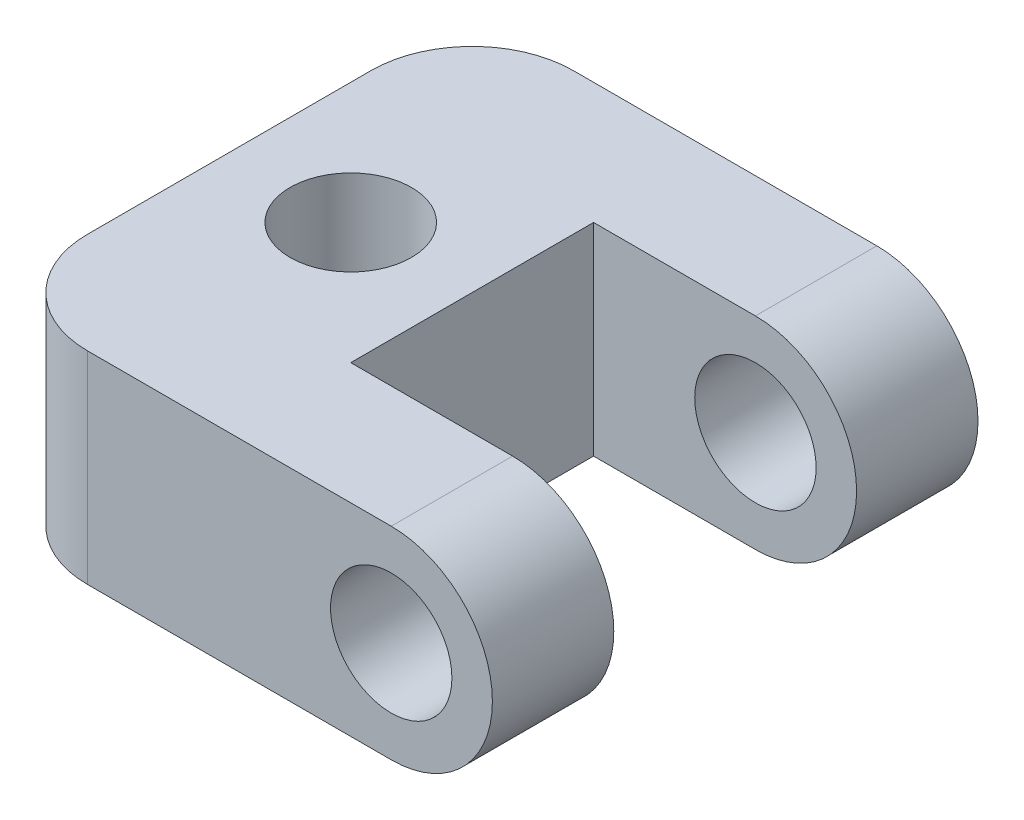
ISO-10303-21;
HEADER;
FILE_DESCRIPTION(('STEP AP214'),'2;1');
FILE_NAME('part.step','',(''),(''),'','','');
FILE_SCHEMA(('AUTOMOTIVE_DESIGN { 1 0 10303 214 1 1 1 1 }'));
ENDSEC;
DATA;
#1=APPLICATION_CONTEXT('core data for automotive mechanical design processes');
#2=APPLICATION_PROTOCOL_DEFINITION('international standard','automotive_design',2000,#1);
#3=PRODUCT_CONTEXT('',#1,'mechanical');
#4=PRODUCT('Part','Part','',(#3));
#5=PRODUCT_RELATED_PRODUCT_CATEGORY('part','',(#4));
#6=PRODUCT_DEFINITION_FORMATION('','',#4);
#7=PRODUCT_DEFINITION_CONTEXT('part definition',#1,'design');
#8=PRODUCT_DEFINITION('design','',#6,#7);
#9=PRODUCT_DEFINITION_SHAPE('','',#8);
#10=(LENGTH_UNIT() NAMED_UNIT(*) SI_UNIT(.MILLI.,.METRE.));
#11=(NAMED_UNIT(*) PLANE_ANGLE_UNIT() SI_UNIT($,.RADIAN.));
#12=(NAMED_UNIT(*) SI_UNIT($,.STERADIAN.) SOLID_ANGLE_UNIT());
#13=UNCERTAINTY_MEASURE_WITH_UNIT(LENGTH_MEASURE(1.E-05),#10,'distance_accuracy_value','');
#14=(GEOMETRIC_REPRESENTATION_CONTEXT(3) GLOBAL_UNCERTAINTY_ASSIGNED_CONTEXT((#13)) GLOBAL_UNIT_ASSIGNED_CONTEXT((#10,
#11,#12)) REPRESENTATION_CONTEXT('',''));
#15=CARTESIAN_POINT('',(0.,0.,0.));
#16=DIRECTION('',(0.,0.,1.));
#17=DIRECTION('',(1.,0.,0.));
#18=AXIS2_PLACEMENT_3D('',#15,#16,#17);
#19=CARTESIAN_POINT('',(10.,2.5,-12.));
#20=DIRECTION('',(0.,0.,1.));
#21=DIRECTION('',(1.,0.,0.));
#22=AXIS2_PLACEMENT_3D('',#19,#20,#21);
#23=CYLINDRICAL_SURFACE('',#22,2.5);
#24=CARTESIAN_POINT('',(10.,2.5,-9.));
#25=DIRECTION('',(0.,0.,-1.));
#26=DIRECTION('',(-1.,0.,0.));
#27=AXIS2_PLACEMENT_3D('',#24,#25,#26);
#28=CIRCLE('',#27,2.5);
#29=CARTESIAN_POINT('',(10.,0.,-9.));
#30=VERTEX_POINT('',#29);
#31=CARTESIAN_POINT('',(10.,5.,-9.));
#32=VERTEX_POINT('',#31);
#33=EDGE_CURVE('E154',#30,#32,#28,.F.);
#34=ORIENTED_EDGE('',*,*,#33,.F.);
#35=DIRECTION('',(0.,0.,1.));
#36=VECTOR('',#35,1.);
#37=CARTESIAN_POINT('',(10.,0.,-12.));
#38=LINE('',#37,#36);
#39=CARTESIAN_POINT('',(10.,0.,-12.));
#40=VERTEX_POINT('',#39);
#41=EDGE_CURVE('E177',#40,#30,#38,.T.);
#42=ORIENTED_EDGE('',*,*,#41,.F.);
#43=CARTESIAN_POINT('',(10.,2.5,-12.));
#44=DIRECTION('',(0.,0.,1.));
#45=DIRECTION('',(1.,0.,0.));
#46=AXIS2_PLACEMENT_3D('',#43,#44,#45);
#47=CIRCLE('',#46,2.5);
#48=CARTESIAN_POINT('',(10.,5.,-12.));
#49=VERTEX_POINT('',#48);
#50=EDGE_CURVE('E159',#40,#49,#47,.T.);
#51=ORIENTED_EDGE('',*,*,#50,.T.);
#52=DIRECTION('',(0.,0.,1.));
#53=VECTOR('',#52,1.);
#54=CARTESIAN_POINT('',(10.,5.,-12.));
#55=LINE('',#54,#53);
#56=EDGE_CURVE('E173',#49,#32,#55,.T.);
#57=ORIENTED_EDGE('',*,*,#56,.T.);
#58=EDGE_LOOP('',(#34,#42,#51,#57));
#59=FACE_BOUND('',#58,.T.);
#60=ADVANCED_FACE('F35',(#59),#23,.T.);
#61=CARTESIAN_POINT('',(0.,5.,-12.));
#62=DIRECTION('',(-1.,0.,0.));
#63=DIRECTION('',(0.,0.,1.));
#64=AXIS2_PLACEMENT_3D('',#61,#62,#63);
#65=PLANE('',#64);
#66=DIRECTION('',(0.,0.,1.));
#67=VECTOR('',#66,1.);
#68=CARTESIAN_POINT('',(0.,5.,-12.));
#69=LINE('',#68,#67);
#70=CARTESIAN_POINT('',(0.,5.,-9.5));
#71=VERTEX_POINT('',#70);
#72=CARTESIAN_POINT('',(0.,5.,-2.5));
#73=VERTEX_POINT('',#72);
#74=EDGE_CURVE('E171',#71,#73,#69,.T.);
#75=ORIENTED_EDGE('',*,*,#74,.F.);
#76=DIRECTION('',(0.,-1.,0.));
#77=VECTOR('',#76,1.);
#78=CARTESIAN_POINT('',(0.,0.,-9.5));
#79=LINE('',#78,#77);
#80=CARTESIAN_POINT('',(0.,0.,-9.5));
#81=VERTEX_POINT('',#80);
#82=EDGE_CURVE('E189',#71,#81,#79,.T.);
#83=ORIENTED_EDGE('',*,*,#82,.T.);
#84=DIRECTION('',(0.,0.,1.));
#85=VECTOR('',#84,1.);
#86=CARTESIAN_POINT('',(0.,0.,-12.));
#87=LINE('',#86,#85);
#88=CARTESIAN_POINT('',(0.,0.,-2.5));
#89=VERTEX_POINT('',#88);
#90=EDGE_CURVE('E165',#81,#89,#87,.T.);
#91=ORIENTED_EDGE('',*,*,#90,.T.);
#92=DIRECTION('',(0.,-1.,0.));
#93=VECTOR('',#92,1.);
#94=CARTESIAN_POINT('',(0.,5.,-2.5));
#95=LINE('',#94,#93);
#96=EDGE_CURVE('E183',#89,#73,#95,.F.);
#97=ORIENTED_EDGE('',*,*,#96,.T.);
#98=EDGE_LOOP('',(#75,#83,#91,#97));
#99=FACE_BOUND('',#98,.T.);
#100=ADVANCED_FACE('F203',(#99),#65,.T.);
#101=CARTESIAN_POINT('',(10.,5.,-12.));
#102=DIRECTION('',(0.,1.,0.));
#103=DIRECTION('',(0.,0.,1.));
#104=AXIS2_PLACEMENT_3D('',#101,#102,#103);
#105=PLANE('',#104);
#106=CARTESIAN_POINT('',(3.,5.,-6.));
#107=DIRECTION('',(0.,1.,0.));
#108=DIRECTION('',(0.,0.,1.));
#109=AXIS2_PLACEMENT_3D('',#106,#107,#108);
#110=CIRCLE('',#109,1.5);
#111=CARTESIAN_POINT('',(3.,5.,-4.5));
#112=VERTEX_POINT('',#111);
#113=EDGE_CURVE('E275',#112,#112,#110,.T.);
#114=ORIENTED_EDGE('',*,*,#113,.F.);
#115=EDGE_LOOP('',(#114));
#116=FACE_BOUND('',#115,.T.);
#117=DIRECTION('',(-1.,0.,0.));
#118=VECTOR('',#117,1.);
#119=CARTESIAN_POINT('',(10.,5.,-12.));
#120=LINE('',#119,#118);
#121=CARTESIAN_POINT('',(2.5,5.,-12.));
#122=VERTEX_POINT('',#121);
#123=EDGE_CURVE('E163',#49,#122,#120,.T.);
#124=ORIENTED_EDGE('',*,*,#123,.T.);
#125=CARTESIAN_POINT('',(2.5,5.,-9.5));
#126=DIRECTION('',(0.,1.,0.));
#127=DIRECTION('',(0.,0.,1.));
#128=AXIS2_PLACEMENT_3D('',#125,#126,#127);
#129=CIRCLE('',#128,2.5);
#130=EDGE_CURVE('E43',#122,#71,#129,.T.);
#131=ORIENTED_EDGE('',*,*,#130,.T.);
#132=ORIENTED_EDGE('',*,*,#74,.T.);
#133=CARTESIAN_POINT('',(2.5,5.,-2.5));
#134=DIRECTION('',(0.,1.,0.));
#135=DIRECTION('',(0.,0.,1.));
#136=AXIS2_PLACEMENT_3D('',#133,#134,#135);
#137=CIRCLE('',#136,2.5);
#138=CARTESIAN_POINT('',(2.5,5.,0.));
#139=VERTEX_POINT('',#138);
#140=EDGE_CURVE('E50',#73,#139,#137,.T.);
#141=ORIENTED_EDGE('',*,*,#140,.T.);
#142=DIRECTION('',(-1.,0.,0.));
#143=VECTOR('',#142,1.);
#144=CARTESIAN_POINT('',(10.,5.,0.));
#145=LINE('',#144,#143);
#146=CARTESIAN_POINT('',(10.,5.,0.));
#147=VERTEX_POINT('',#146);
#148=EDGE_CURVE('E160',#147,#139,#145,.T.);
#149=ORIENTED_EDGE('',*,*,#148,.F.);
#150=CARTESIAN_POINT('',(10.,5.,-3.));
#151=VERTEX_POINT('',#150);
#152=EDGE_CURVE('E176',#151,#147,#55,.T.);
#153=ORIENTED_EDGE('',*,*,#152,.F.);
#154=DIRECTION('',(1.,0.,0.));
#155=VECTOR('',#154,1.);
#156=CARTESIAN_POINT('',(6.,5.,-3.));
#157=LINE('',#156,#155);
#158=CARTESIAN_POINT('',(6.,5.,-3.));
#159=VERTEX_POINT('',#158);
#160=EDGE_CURVE('E144',#159,#151,#157,.T.);
#161=ORIENTED_EDGE('',*,*,#160,.F.);
#162=DIRECTION('',(0.,0.,1.));
#163=VECTOR('',#162,1.);
#164=CARTESIAN_POINT('',(6.,5.,-9.));
#165=LINE('',#164,#163);
#166=CARTESIAN_POINT('',(6.,5.,-9.));
#167=VERTEX_POINT('',#166);
#168=EDGE_CURVE('E124',#167,#159,#165,.T.);
#169=ORIENTED_EDGE('',*,*,#168,.F.);
#170=DIRECTION('',(-1.,0.,0.));
#171=VECTOR('',#170,1.);
#172=CARTESIAN_POINT('',(6.,5.,-9.));
#173=LINE('',#172,#171);
#174=EDGE_CURVE('E142',#32,#167,#173,.T.);
#175=ORIENTED_EDGE('',*,*,#174,.F.);
#176=ORIENTED_EDGE('',*,*,#56,.F.);
#177=EDGE_LOOP('',(#124,#131,#132,#141,#149,#153,#161,#169,#175,#176));
#178=FACE_BOUND('',#177,.T.);
#179=ADVANCED_FACE('F199',(#116,#178),#105,.T.);
#180=CARTESIAN_POINT('',(10.,2.5,-3.));
#181=DIRECTION('',(0.,0.,1.));
#182=DIRECTION('',(1.,0.,0.));
#183=AXIS2_PLACEMENT_3D('',#180,#181,#182);
#184=CIRCLE('',#183,2.5);
#185=CARTESIAN_POINT('',(10.,0.,-3.));
#186=VERTEX_POINT('',#185);
#187=EDGE_CURVE('E133',#151,#186,#184,.F.);
#188=ORIENTED_EDGE('',*,*,#187,.F.);
#189=ORIENTED_EDGE('',*,*,#152,.T.);
#190=CARTESIAN_POINT('',(10.,2.5,0.));
#191=DIRECTION('',(0.,0.,1.));
#192=DIRECTION('',(1.,0.,0.));
#193=AXIS2_PLACEMENT_3D('',#190,#191,#192);
#194=CIRCLE('',#193,2.5);
#195=CARTESIAN_POINT('',(10.,0.,0.));
#196=VERTEX_POINT('',#195);
#197=EDGE_CURVE('E167',#196,#147,#194,.T.);
#198=ORIENTED_EDGE('',*,*,#197,.F.);
#199=EDGE_CURVE('E179',#186,#196,#38,.T.);
#200=ORIENTED_EDGE('',*,*,#199,.F.);
#201=EDGE_LOOP('',(#188,#189,#198,#200));
#202=FACE_BOUND('',#201,.T.);
#203=ADVANCED_FACE('F217',(#202),#23,.T.);
#204=CARTESIAN_POINT('',(0.,0.,-12.));
#205=DIRECTION('',(0.,-1.,0.));
#206=DIRECTION('',(0.,0.,-1.));
#207=AXIS2_PLACEMENT_3D('',#204,#205,#206);
#208=PLANE('',#207);
#209=CARTESIAN_POINT('',(3.,0.,-6.));
#210=DIRECTION('',(0.,1.,0.));
#211=DIRECTION('',(0.,0.,1.));
#212=AXIS2_PLACEMENT_3D('',#209,#210,#211);
#213=CIRCLE('',#212,1.5);
#214=CARTESIAN_POINT('',(3.,0.,-4.5));
#215=VERTEX_POINT('',#214);
#216=EDGE_CURVE('E273',#215,#215,#213,.T.);
#217=ORIENTED_EDGE('',*,*,#216,.T.);
#218=EDGE_LOOP('',(#217));
#219=FACE_BOUND('',#218,.T.);
#220=ORIENTED_EDGE('',*,*,#90,.F.);
#221=CARTESIAN_POINT('',(2.5,0.,-9.5));
#222=DIRECTION('',(0.,-1.,0.));
#223=DIRECTION('',(0.,0.,-1.));
#224=AXIS2_PLACEMENT_3D('',#221,#222,#223);
#225=CIRCLE('',#224,2.5);
#226=CARTESIAN_POINT('',(2.5,0.,-12.));
#227=VERTEX_POINT('',#226);
#228=EDGE_CURVE('E194',#81,#227,#225,.T.);
#229=ORIENTED_EDGE('',*,*,#228,.T.);
#230=DIRECTION('',(1.,0.,0.));
#231=VECTOR('',#230,1.);
#232=CARTESIAN_POINT('',(0.,0.,-12.));
#233=LINE('',#232,#231);
#234=EDGE_CURVE('E157',#227,#40,#233,.T.);
#235=ORIENTED_EDGE('',*,*,#234,.T.);
#236=ORIENTED_EDGE('',*,*,#41,.T.);
#237=DIRECTION('',(1.,0.,0.));
#238=VECTOR('',#237,1.);
#239=CARTESIAN_POINT('',(0.,0.,-9.));
#240=LINE('',#239,#238);
#241=CARTESIAN_POINT('',(6.,0.,-9.));
#242=VERTEX_POINT('',#241);
#243=EDGE_CURVE('E141',#242,#30,#240,.T.);
#244=ORIENTED_EDGE('',*,*,#243,.F.);
#245=DIRECTION('',(0.,0.,1.));
#246=VECTOR('',#245,1.);
#247=CARTESIAN_POINT('',(6.,0.,-9.));
#248=LINE('',#247,#246);
#249=CARTESIAN_POINT('',(6.,0.,-3.));
#250=VERTEX_POINT('',#249);
#251=EDGE_CURVE('E121',#242,#250,#248,.T.);
#252=ORIENTED_EDGE('',*,*,#251,.T.);
#253=DIRECTION('',(1.,0.,0.));
#254=VECTOR('',#253,1.);
#255=CARTESIAN_POINT('',(6.,0.,-3.));
#256=LINE('',#255,#254);
#257=EDGE_CURVE('E129',#250,#186,#256,.T.);
#258=ORIENTED_EDGE('',*,*,#257,.T.);
#259=ORIENTED_EDGE('',*,*,#199,.T.);
#260=DIRECTION('',(1.,0.,0.));
#261=VECTOR('',#260,1.);
#262=CARTESIAN_POINT('',(0.,0.,0.));
#263=LINE('',#262,#261);
#264=CARTESIAN_POINT('',(2.5,0.,0.));
#265=VERTEX_POINT('',#264);
#266=EDGE_CURVE('E156',#265,#196,#263,.T.);
#267=ORIENTED_EDGE('',*,*,#266,.F.);
#268=CARTESIAN_POINT('',(2.5,0.,-2.5));
#269=DIRECTION('',(0.,-1.,0.));
#270=DIRECTION('',(0.,0.,-1.));
#271=AXIS2_PLACEMENT_3D('',#268,#269,#270);
#272=CIRCLE('',#271,2.5);
#273=EDGE_CURVE('E192',#265,#89,#272,.T.);
#274=ORIENTED_EDGE('',*,*,#273,.T.);
#275=EDGE_LOOP('',(#220,#229,#235,#236,#244,#252,#258,#259,#267,#274));
#276=FACE_BOUND('',#275,.T.);
#277=ADVANCED_FACE('F139',(#219,#276),#208,.T.);
#278=CARTESIAN_POINT('',(10.,2.5,-12.));
#279=DIRECTION('',(0.,0.,1.));
#280=DIRECTION('',(1.,0.,0.));
#281=AXIS2_PLACEMENT_3D('',#278,#279,#280);
#282=PLANE('',#281);
#283=CARTESIAN_POINT('',(10.,2.5,-12.));
#284=DIRECTION('',(0.,0.,1.));
#285=DIRECTION('',(1.,0.,0.));
#286=AXIS2_PLACEMENT_3D('',#283,#284,#285);
#287=CIRCLE('',#286,1.5);
#288=CARTESIAN_POINT('',(11.5,2.5,-12.));
#289=VERTEX_POINT('',#288);
#290=EDGE_CURVE('E187',#289,#289,#287,.T.);
#291=ORIENTED_EDGE('',*,*,#290,.T.);
#292=EDGE_LOOP('',(#291));
#293=FACE_BOUND('',#292,.T.);
#294=ORIENTED_EDGE('',*,*,#234,.F.);
#295=DIRECTION('',(0.,-1.,0.));
#296=VECTOR('',#295,1.);
#297=CARTESIAN_POINT('',(2.5,5.,-12.));
#298=LINE('',#297,#296);
#299=EDGE_CURVE('E58',#227,#122,#298,.F.);
#300=ORIENTED_EDGE('',*,*,#299,.T.);
#301=ORIENTED_EDGE('',*,*,#123,.F.);
#302=ORIENTED_EDGE('',*,*,#50,.F.);
#303=EDGE_LOOP('',(#294,#300,#301,#302));
#304=FACE_BOUND('',#303,.T.);
#305=ADVANCED_FACE('F208',(#293,#304),#282,.F.);
#306=CARTESIAN_POINT('',(10.,2.5,0.));
#307=DIRECTION('',(0.,0.,1.));
#308=DIRECTION('',(1.,0.,0.));
#309=AXIS2_PLACEMENT_3D('',#306,#307,#308);
#310=PLANE('',#309);
#311=CARTESIAN_POINT('',(10.,2.5,0.));
#312=DIRECTION('',(0.,0.,1.));
#313=DIRECTION('',(1.,0.,0.));
#314=AXIS2_PLACEMENT_3D('',#311,#312,#313);
#315=CIRCLE('',#314,1.5);
#316=CARTESIAN_POINT('',(11.5,2.5,0.));
#317=VERTEX_POINT('',#316);
#318=EDGE_CURVE('E277',#317,#317,#315,.T.);
#319=ORIENTED_EDGE('',*,*,#318,.F.);
#320=EDGE_LOOP('',(#319));
#321=FACE_BOUND('',#320,.T.);
#322=ORIENTED_EDGE('',*,*,#148,.T.);
#323=DIRECTION('',(0.,-1.,0.));
#324=VECTOR('',#323,1.);
#325=CARTESIAN_POINT('',(2.5,2.5,0.));
#326=LINE('',#325,#324);
#327=EDGE_CURVE('E11',#139,#265,#326,.T.);
#328=ORIENTED_EDGE('',*,*,#327,.T.);
#329=ORIENTED_EDGE('',*,*,#266,.T.);
#330=ORIENTED_EDGE('',*,*,#197,.T.);
#331=EDGE_LOOP('',(#322,#328,#329,#330));
#332=FACE_BOUND('',#331,.T.);
#333=ADVANCED_FACE('F219',(#321,#332),#310,.T.);
#334=CARTESIAN_POINT('',(6.,0.,-9.));
#335=DIRECTION('',(-1.,0.,0.));
#336=DIRECTION('',(0.,0.,1.));
#337=AXIS2_PLACEMENT_3D('',#334,#335,#336);
#338=PLANE('',#337);
#339=ORIENTED_EDGE('',*,*,#168,.T.);
#340=DIRECTION('',(0.,1.,0.));
#341=VECTOR('',#340,1.);
#342=CARTESIAN_POINT('',(6.,0.,-3.));
#343=LINE('',#342,#341);
#344=EDGE_CURVE('E116',#250,#159,#343,.T.);
#345=ORIENTED_EDGE('',*,*,#344,.F.);
#346=ORIENTED_EDGE('',*,*,#251,.F.);
#347=DIRECTION('',(0.,1.,0.));
#348=VECTOR('',#347,1.);
#349=CARTESIAN_POINT('',(6.,0.,-9.));
#350=LINE('',#349,#348);
#351=EDGE_CURVE('E128',#242,#167,#350,.T.);
#352=ORIENTED_EDGE('',*,*,#351,.T.);
#353=EDGE_LOOP('',(#339,#345,#346,#352));
#354=FACE_BOUND('',#353,.T.);
#355=ADVANCED_FACE('F118',(#354),#338,.F.);
#356=CARTESIAN_POINT('',(6.,0.,-9.));
#357=DIRECTION('',(0.,0.,-1.));
#358=DIRECTION('',(-1.,0.,0.));
#359=AXIS2_PLACEMENT_3D('',#356,#357,#358);
#360=PLANE('',#359);
#361=CARTESIAN_POINT('',(10.,2.5,-9.));
#362=DIRECTION('',(0.,0.,-1.));
#363=DIRECTION('',(-1.,0.,0.));
#364=AXIS2_PLACEMENT_3D('',#361,#362,#363);
#365=CIRCLE('',#364,1.5);
#366=CARTESIAN_POINT('',(8.5,2.5,-9.));
#367=VERTEX_POINT('',#366);
#368=EDGE_CURVE('E147',#367,#367,#365,.T.);
#369=ORIENTED_EDGE('',*,*,#368,.T.);
#370=EDGE_LOOP('',(#369));
#371=FACE_BOUND('',#370,.T.);
#372=ORIENTED_EDGE('',*,*,#33,.T.);
#373=ORIENTED_EDGE('',*,*,#174,.T.);
#374=ORIENTED_EDGE('',*,*,#351,.F.);
#375=ORIENTED_EDGE('',*,*,#243,.T.);
#376=EDGE_LOOP('',(#372,#373,#374,#375));
#377=FACE_BOUND('',#376,.T.);
#378=ADVANCED_FACE('F213',(#371,#377),#360,.F.);
#379=CARTESIAN_POINT('',(6.,0.,-3.));
#380=DIRECTION('',(0.,0.,1.));
#381=DIRECTION('',(1.,0.,0.));
#382=AXIS2_PLACEMENT_3D('',#379,#380,#381);
#383=PLANE('',#382);
#384=CARTESIAN_POINT('',(10.,2.5,-3.));
#385=DIRECTION('',(0.,0.,1.));
#386=DIRECTION('',(1.,0.,0.));
#387=AXIS2_PLACEMENT_3D('',#384,#385,#386);
#388=CIRCLE('',#387,1.5);
#389=CARTESIAN_POINT('',(11.5,2.5,-3.));
#390=VERTEX_POINT('',#389);
#391=EDGE_CURVE('E184',#390,#390,#388,.T.);
#392=ORIENTED_EDGE('',*,*,#391,.T.);
#393=EDGE_LOOP('',(#392));
#394=FACE_BOUND('',#393,.T.);
#395=ORIENTED_EDGE('',*,*,#187,.T.);
#396=ORIENTED_EDGE('',*,*,#257,.F.);
#397=ORIENTED_EDGE('',*,*,#344,.T.);
#398=ORIENTED_EDGE('',*,*,#160,.T.);
#399=EDGE_LOOP('',(#395,#396,#397,#398));
#400=FACE_BOUND('',#399,.T.);
#401=ADVANCED_FACE('F132',(#394,#400),#383,.F.);
#402=CARTESIAN_POINT('',(10.,2.5,-12.));
#403=DIRECTION('',(0.,0.,1.));
#404=DIRECTION('',(1.,0.,0.));
#405=AXIS2_PLACEMENT_3D('',#402,#403,#404);
#406=CYLINDRICAL_SURFACE('',#405,1.5);
#407=ORIENTED_EDGE('',*,*,#318,.T.);
#408=EDGE_LOOP('',(#407));
#409=FACE_BOUND('',#408,.T.);
#410=ORIENTED_EDGE('',*,*,#391,.F.);
#411=EDGE_LOOP('',(#410));
#412=FACE_BOUND('',#411,.T.);
#413=ADVANCED_FACE('F257',(#409,#412),#406,.F.);
#414=ORIENTED_EDGE('',*,*,#290,.F.);
#415=EDGE_LOOP('',(#414));
#416=FACE_BOUND('',#415,.T.);
#417=ORIENTED_EDGE('',*,*,#368,.F.);
#418=EDGE_LOOP('',(#417));
#419=FACE_BOUND('',#418,.T.);
#420=ADVANCED_FACE('F262',(#416,#419),#406,.F.);
#421=CARTESIAN_POINT('',(3.,0.,-6.));
#422=DIRECTION('',(0.,1.,0.));
#423=DIRECTION('',(0.,0.,1.));
#424=AXIS2_PLACEMENT_3D('',#421,#422,#423);
#425=CYLINDRICAL_SURFACE('',#424,1.5);
#426=ORIENTED_EDGE('',*,*,#216,.F.);
#427=EDGE_LOOP('',(#426));
#428=FACE_BOUND('',#427,.T.);
#429=ORIENTED_EDGE('',*,*,#113,.T.);
#430=EDGE_LOOP('',(#429));
#431=FACE_BOUND('',#430,.T.);
#432=ADVANCED_FACE('F227',(#428,#431),#425,.F.);
#433=CARTESIAN_POINT('',(2.5,5.,-9.5));
#434=DIRECTION('',(0.,1.,0.));
#435=DIRECTION('',(0.,0.,1.));
#436=AXIS2_PLACEMENT_3D('',#433,#434,#435);
#437=CYLINDRICAL_SURFACE('',#436,2.5);
#438=ORIENTED_EDGE('',*,*,#130,.F.);
#439=ORIENTED_EDGE('',*,*,#299,.F.);
#440=ORIENTED_EDGE('',*,*,#228,.F.);
#441=ORIENTED_EDGE('',*,*,#82,.F.);
#442=EDGE_LOOP('',(#438,#439,#440,#441));
#443=FACE_BOUND('',#442,.T.);
#444=ADVANCED_FACE('F205',(#443),#437,.T.);
#445=CARTESIAN_POINT('',(2.5,2.5,-2.5));
#446=DIRECTION('',(0.,-1.,0.));
#447=DIRECTION('',(0.,0.,-1.));
#448=AXIS2_PLACEMENT_3D('',#445,#446,#447);
#449=CYLINDRICAL_SURFACE('',#448,2.5);
#450=ORIENTED_EDGE('',*,*,#140,.F.);
#451=ORIENTED_EDGE('',*,*,#96,.F.);
#452=ORIENTED_EDGE('',*,*,#273,.F.);
#453=ORIENTED_EDGE('',*,*,#327,.F.);
#454=EDGE_LOOP('',(#450,#451,#452,#453));
#455=FACE_BOUND('',#454,.T.);
#456=ADVANCED_FACE('F37',(#455),#449,.T.);
#457=CLOSED_SHELL('',(#60,#100,#179,#203,#277,#305,#333,#355,#378,#401,#413,#420,#432,#444,#456));
#458=MANIFOLD_SOLID_BREP('B2',#457);
#459=ADVANCED_BREP_SHAPE_REPRESENTATION('',(#18,#458),#14);
#460=SHAPE_DEFINITION_REPRESENTATION(#9,#459);
ENDSEC;
END-ISO-10303-21;
